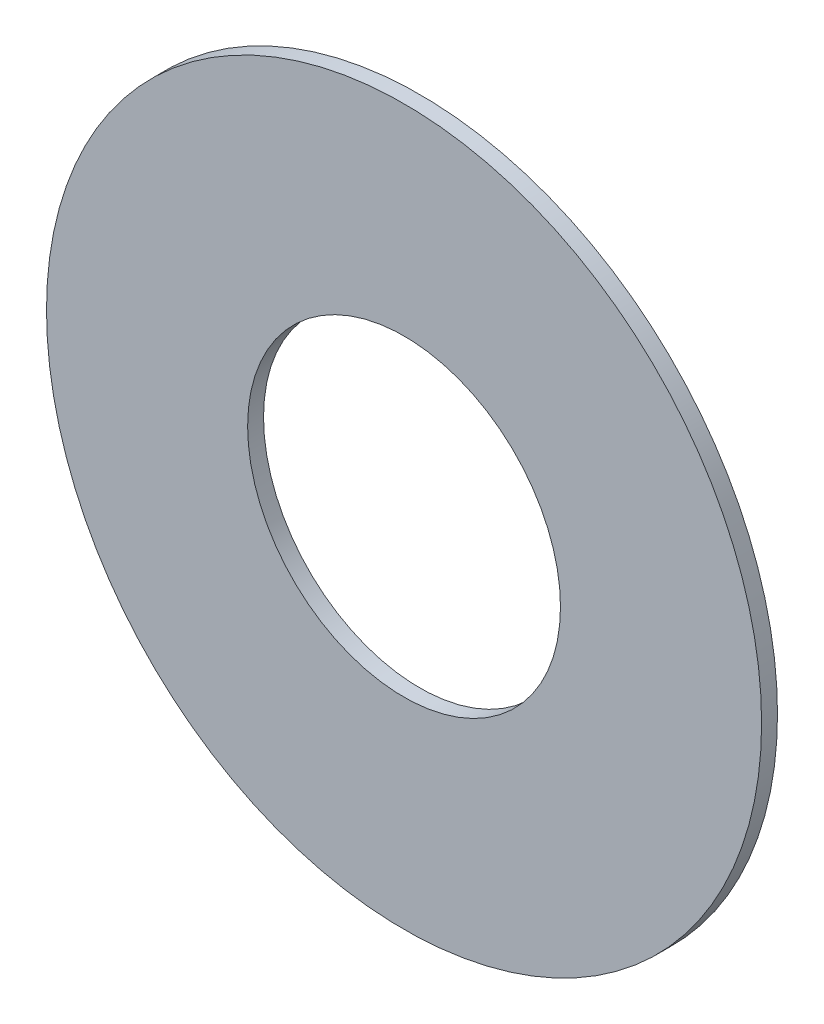
ISO-10303-21;
HEADER;
FILE_DESCRIPTION(('STEP AP214'),'2;1');
FILE_NAME('part.step','',(''),(''),'','','');
FILE_SCHEMA(('AUTOMOTIVE_DESIGN { 1 0 10303 214 1 1 1 1 }'));
ENDSEC;
DATA;
#1=APPLICATION_CONTEXT('core data for automotive mechanical design processes');
#2=APPLICATION_PROTOCOL_DEFINITION('international standard','automotive_design',2000,#1);
#3=PRODUCT_CONTEXT('',#1,'mechanical');
#4=PRODUCT('Part','Part','',(#3));
#5=PRODUCT_RELATED_PRODUCT_CATEGORY('part','',(#4));
#6=PRODUCT_DEFINITION_FORMATION('','',#4);
#7=PRODUCT_DEFINITION_CONTEXT('part definition',#1,'design');
#8=PRODUCT_DEFINITION('design','',#6,#7);
#9=PRODUCT_DEFINITION_SHAPE('','',#8);
#10=(LENGTH_UNIT() NAMED_UNIT(*) SI_UNIT(.MILLI.,.METRE.));
#11=(NAMED_UNIT(*) PLANE_ANGLE_UNIT() SI_UNIT($,.RADIAN.));
#12=(NAMED_UNIT(*) SI_UNIT($,.STERADIAN.) SOLID_ANGLE_UNIT());
#13=UNCERTAINTY_MEASURE_WITH_UNIT(LENGTH_MEASURE(1.E-05),#10,'distance_accuracy_value','');
#14=(GEOMETRIC_REPRESENTATION_CONTEXT(3) GLOBAL_UNCERTAINTY_ASSIGNED_CONTEXT((#13)) GLOBAL_UNIT_ASSIGNED_CONTEXT((#10,
#11,#12)) REPRESENTATION_CONTEXT('',''));
#15=CARTESIAN_POINT('',(0.,0.,0.));
#16=DIRECTION('',(0.,0.,1.));
#17=DIRECTION('',(1.,0.,0.));
#18=AXIS2_PLACEMENT_3D('',#15,#16,#17);
#19=CARTESIAN_POINT('',(0.,0.,0.));
#20=DIRECTION('',(0.,0.,-1.));
#21=DIRECTION('',(1.,0.,0.));
#22=AXIS2_PLACEMENT_3D('',#19,#20,#21);
#23=CYLINDRICAL_SURFACE('',#22,0.7999984);
#24=CARTESIAN_POINT('',(0.,0.,0.03556));
#25=DIRECTION('',(0.,0.,1.));
#26=DIRECTION('',(1.,0.,0.));
#27=AXIS2_PLACEMENT_3D('',#24,#25,#26);
#28=CIRCLE('',#27,0.7999984);
#29=CARTESIAN_POINT('',(0.7999984,0.,0.03556));
#30=VERTEX_POINT('',#29);
#31=EDGE_CURVE('E11',#30,#30,#28,.T.);
#32=ORIENTED_EDGE('',*,*,#31,.F.);
#33=DIRECTION('',(0.,0.,1.));
#34=VECTOR('',#33,1.);
#35=CARTESIAN_POINT('',(0.7999984,0.,0.));
#36=LINE('',#35,#34);
#37=CARTESIAN_POINT('',(0.7999984,0.,0.));
#38=VERTEX_POINT('',#37);
#39=EDGE_CURVE('E24',#38,#30,#36,.T.);
#40=ORIENTED_EDGE('',*,*,#39,.F.);
#41=CARTESIAN_POINT('',(0.,0.,0.));
#42=DIRECTION('',(0.,0.,1.));
#43=DIRECTION('',(1.,0.,0.));
#44=AXIS2_PLACEMENT_3D('',#41,#42,#43);
#45=CIRCLE('',#44,0.7999984);
#46=EDGE_CURVE('E46',#38,#38,#45,.T.);
#47=ORIENTED_EDGE('',*,*,#46,.T.);
#48=ORIENTED_EDGE('',*,*,#39,.T.);
#49=EDGE_LOOP('',(#32,#40,#47,#48));
#50=FACE_BOUND('',#49,.T.);
#51=ADVANCED_FACE('F17',(#50),#23,.T.);
#52=CARTESIAN_POINT('',(0.,0.,0.));
#53=DIRECTION('',(0.,0.,-1.));
#54=DIRECTION('',(1.,0.,0.));
#55=AXIS2_PLACEMENT_3D('',#52,#53,#54);
#56=CYLINDRICAL_SURFACE('',#55,0.3499993);
#57=DIRECTION('',(0.,0.,1.));
#58=VECTOR('',#57,1.);
#59=CARTESIAN_POINT('',(0.3499993,0.,0.));
#60=LINE('',#59,#58);
#61=CARTESIAN_POINT('',(0.3499993,0.,0.));
#62=VERTEX_POINT('',#61);
#63=CARTESIAN_POINT('',(0.3499993,0.,0.03556));
#64=VERTEX_POINT('',#63);
#65=EDGE_CURVE('E40',#62,#64,#60,.T.);
#66=ORIENTED_EDGE('',*,*,#65,.T.);
#67=CARTESIAN_POINT('',(0.,0.,0.03556));
#68=DIRECTION('',(0.,0.,1.));
#69=DIRECTION('',(1.,0.,0.));
#70=AXIS2_PLACEMENT_3D('',#67,#68,#69);
#71=CIRCLE('',#70,0.3499993);
#72=EDGE_CURVE('E45',#64,#64,#71,.T.);
#73=ORIENTED_EDGE('',*,*,#72,.T.);
#74=ORIENTED_EDGE('',*,*,#65,.F.);
#75=CARTESIAN_POINT('',(0.,0.,0.));
#76=DIRECTION('',(0.,0.,1.));
#77=DIRECTION('',(1.,0.,0.));
#78=AXIS2_PLACEMENT_3D('',#75,#76,#77);
#79=CIRCLE('',#78,0.3499993);
#80=EDGE_CURVE('E43',#62,#62,#79,.T.);
#81=ORIENTED_EDGE('',*,*,#80,.F.);
#82=EDGE_LOOP('',(#66,#73,#74,#81));
#83=FACE_BOUND('',#82,.T.);
#84=ADVANCED_FACE('F42',(#83),#56,.F.);
#85=CARTESIAN_POINT('',(0.7999984,0.,0.));
#86=DIRECTION('',(0.,0.,-1.));
#87=DIRECTION('',(-1.,0.,0.));
#88=AXIS2_PLACEMENT_3D('',#85,#86,#87);
#89=PLANE('',#88);
#90=ORIENTED_EDGE('',*,*,#46,.F.);
#91=EDGE_LOOP('',(#90));
#92=FACE_BOUND('',#91,.T.);
#93=ORIENTED_EDGE('',*,*,#80,.T.);
#94=EDGE_LOOP('',(#93));
#95=FACE_BOUND('',#94,.T.);
#96=ADVANCED_FACE('F49',(#92,#95),#89,.T.);
#97=CARTESIAN_POINT('',(0.7999984,0.,0.03556));
#98=DIRECTION('',(0.,0.,-1.));
#99=DIRECTION('',(-1.,0.,0.));
#100=AXIS2_PLACEMENT_3D('',#97,#98,#99);
#101=PLANE('',#100);
#102=ORIENTED_EDGE('',*,*,#31,.T.);
#103=EDGE_LOOP('',(#102));
#104=FACE_BOUND('',#103,.T.);
#105=ORIENTED_EDGE('',*,*,#72,.F.);
#106=EDGE_LOOP('',(#105));
#107=FACE_BOUND('',#106,.T.);
#108=ADVANCED_FACE('F56',(#104,#107),#101,.F.);
#109=CLOSED_SHELL('',(#51,#84,#96,#108));
#110=MANIFOLD_SOLID_BREP('B1',#109);
#111=ADVANCED_BREP_SHAPE_REPRESENTATION('',(#18,#110),#14);
#112=SHAPE_DEFINITION_REPRESENTATION(#9,#111);
ENDSEC;
END-ISO-10303-21;
